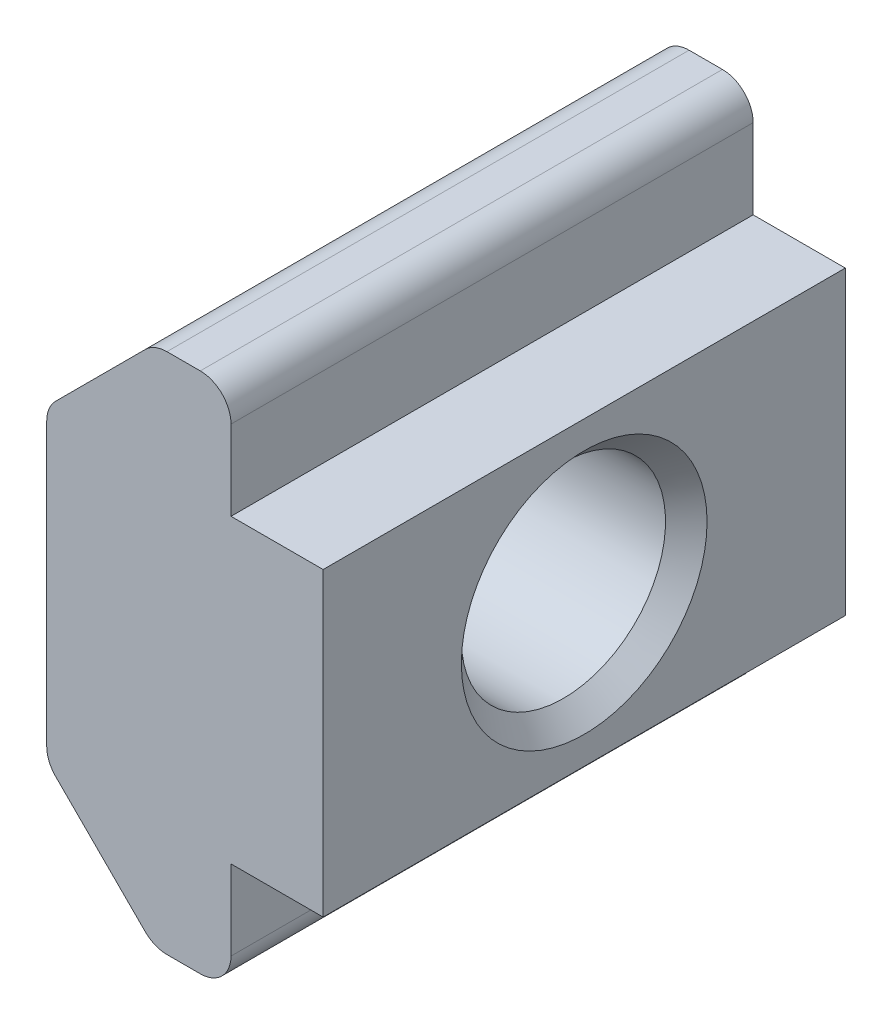
ISO-10303-21;
HEADER;
FILE_DESCRIPTION(('STEP AP214'),'2;1');
FILE_NAME('part.step','',(''),(''),'','','');
FILE_SCHEMA(('AUTOMOTIVE_DESIGN { 1 0 10303 214 1 1 1 1 }'));
ENDSEC;
DATA;
#1=APPLICATION_CONTEXT('core data for automotive mechanical design processes');
#2=APPLICATION_PROTOCOL_DEFINITION('international standard','automotive_design',2000,#1);
#3=PRODUCT_CONTEXT('',#1,'mechanical');
#4=PRODUCT('Part','Part','',(#3));
#5=PRODUCT_RELATED_PRODUCT_CATEGORY('part','',(#4));
#6=PRODUCT_DEFINITION_FORMATION('','',#4);
#7=PRODUCT_DEFINITION_CONTEXT('part definition',#1,'design');
#8=PRODUCT_DEFINITION('design','',#6,#7);
#9=PRODUCT_DEFINITION_SHAPE('','',#8);
#10=(LENGTH_UNIT() NAMED_UNIT(*) SI_UNIT(.MILLI.,.METRE.));
#11=(NAMED_UNIT(*) PLANE_ANGLE_UNIT() SI_UNIT($,.RADIAN.));
#12=(NAMED_UNIT(*) SI_UNIT($,.STERADIAN.) SOLID_ANGLE_UNIT());
#13=UNCERTAINTY_MEASURE_WITH_UNIT(LENGTH_MEASURE(1.E-05),#10,'distance_accuracy_value','');
#14=(GEOMETRIC_REPRESENTATION_CONTEXT(3) GLOBAL_UNCERTAINTY_ASSIGNED_CONTEXT((#13)) GLOBAL_UNIT_ASSIGNED_CONTEXT((#10,
#11,#12)) REPRESENTATION_CONTEXT('',''));
#15=CARTESIAN_POINT('',(0.,0.,0.));
#16=DIRECTION('',(0.,0.,1.));
#17=DIRECTION('',(1.,0.,0.));
#18=AXIS2_PLACEMENT_3D('',#15,#16,#17);
#19=CARTESIAN_POINT('',(-9.,-4.58578643762693,8.5));
#20=DIRECTION('',(-1.,0.,0.));
#21=DIRECTION('',(0.,1.,0.));
#22=AXIS2_PLACEMENT_3D('',#19,#20,#21);
#23=PLANE('',#22);
#24=DIRECTION('',(0.,-1.,0.));
#25=VECTOR('',#24,1.);
#26=CARTESIAN_POINT('',(-9.,4.58578643762693,-8.5));
#27=LINE('',#26,#25);
#28=CARTESIAN_POINT('',(-9.,4.58578643762693,-8.5));
#29=VERTEX_POINT('',#28);
#30=CARTESIAN_POINT('',(-9.,-4.5857864376269,-8.5));
#31=VERTEX_POINT('',#30);
#32=EDGE_CURVE('E131',#29,#31,#27,.T.);
#33=ORIENTED_EDGE('',*,*,#32,.T.);
#34=DIRECTION('',(0.,0.,1.));
#35=VECTOR('',#34,1.);
#36=CARTESIAN_POINT('',(-9.,-4.5857864376269,-8.5));
#37=LINE('',#36,#35);
#38=CARTESIAN_POINT('',(-9.,-4.58578643762693,8.5));
#39=VERTEX_POINT('',#38);
#40=EDGE_CURVE('E146',#39,#31,#37,.F.);
#41=ORIENTED_EDGE('',*,*,#40,.F.);
#42=DIRECTION('',(0.,1.,0.));
#43=VECTOR('',#42,1.);
#44=CARTESIAN_POINT('',(-9.,-4.58578643762693,8.5));
#45=LINE('',#44,#43);
#46=CARTESIAN_POINT('',(-9.,4.5857864376269,8.5));
#47=VERTEX_POINT('',#46);
#48=EDGE_CURVE('E153',#47,#39,#45,.F.);
#49=ORIENTED_EDGE('',*,*,#48,.F.);
#50=DIRECTION('',(0.,0.,-1.));
#51=VECTOR('',#50,1.);
#52=CARTESIAN_POINT('',(-9.,4.5857864376269,8.5));
#53=LINE('',#52,#51);
#54=EDGE_CURVE('E148',#47,#29,#53,.T.);
#55=ORIENTED_EDGE('',*,*,#54,.T.);
#56=EDGE_LOOP('',(#33,#41,#49,#55));
#57=FACE_BOUND('',#56,.T.);
#58=CARTESIAN_POINT('',(-9.,0.,0.));
#59=DIRECTION('',(1.,0.,0.));
#60=DIRECTION('',(0.,-1.42053888207986E-07,0.99999999999999));
#61=AXIS2_PLACEMENT_3D('',#58,#59,#60);
#62=CIRCLE('',#61,4.);
#63=CARTESIAN_POINT('',(-9.,-5.68215552831942E-07,3.99999999999996));
#64=VERTEX_POINT('',#63);
#65=EDGE_CURVE('E139',#64,#64,#62,.T.);
#66=ORIENTED_EDGE('',*,*,#65,.T.);
#67=EDGE_LOOP('',(#66));
#68=FACE_BOUND('',#67,.T.);
#69=ADVANCED_FACE('F17',(#57,#68),#23,.T.);
#70=CARTESIAN_POINT('',(-8.00000000000016,-4.58578643762697,8.5));
#71=DIRECTION('',(0.,0.,-1.));
#72=DIRECTION('',(-0.707106781186453,-0.707106781186642,0.));
#73=AXIS2_PLACEMENT_3D('',#70,#71,#72);
#74=CYLINDRICAL_SURFACE('',#73,0.99999999999984);
#75=CARTESIAN_POINT('',(-8.00000000000016,-4.58578643762697,-8.5));
#76=DIRECTION('',(0.,0.,1.));
#77=DIRECTION('',(-1.,0.,0.));
#78=AXIS2_PLACEMENT_3D('',#75,#76,#77);
#79=CIRCLE('',#78,0.99999999999984);
#80=CARTESIAN_POINT('',(-8.7071067811865,-5.2928932188135,-8.5));
#81=VERTEX_POINT('',#80);
#82=EDGE_CURVE('E128',#31,#81,#79,.T.);
#83=ORIENTED_EDGE('',*,*,#82,.T.);
#84=DIRECTION('',(0.,0.,1.));
#85=VECTOR('',#84,1.);
#86=CARTESIAN_POINT('',(-8.7071067811865,-5.2928932188135,-8.5));
#87=LINE('',#86,#85);
#88=CARTESIAN_POINT('',(-8.7071067811865,-5.2928932188135,8.5));
#89=VERTEX_POINT('',#88);
#90=EDGE_CURVE('E138',#89,#81,#87,.F.);
#91=ORIENTED_EDGE('',*,*,#90,.F.);
#92=CARTESIAN_POINT('',(-8.00000000000016,-4.58578643762697,8.5));
#93=DIRECTION('',(0.,0.,-1.));
#94=DIRECTION('',(-0.707106781186453,-0.707106781186642,0.));
#95=AXIS2_PLACEMENT_3D('',#92,#93,#94);
#96=CIRCLE('',#95,0.99999999999984);
#97=EDGE_CURVE('E152',#39,#89,#96,.F.);
#98=ORIENTED_EDGE('',*,*,#97,.F.);
#99=ORIENTED_EDGE('',*,*,#40,.T.);
#100=EDGE_LOOP('',(#83,#91,#98,#99));
#101=FACE_BOUND('',#100,.T.);
#102=ADVANCED_FACE('F151',(#101),#74,.T.);
#103=CARTESIAN_POINT('',(-5.7928932188135,-8.2071067811865,-8.5));
#104=DIRECTION('',(-0.707106781186548,-0.707106781186548,0.));
#105=DIRECTION('',(0.,0.,1.));
#106=AXIS2_PLACEMENT_3D('',#103,#104,#105);
#107=PLANE('',#106);
#108=DIRECTION('',(0.707106781186547,-0.707106781186548,0.));
#109=VECTOR('',#108,1.);
#110=CARTESIAN_POINT('',(-8.7071067811865,-5.2928932188135,-8.5));
#111=LINE('',#110,#109);
#112=CARTESIAN_POINT('',(-5.7928932188135,-8.2071067811865,-8.5));
#113=VERTEX_POINT('',#112);
#114=EDGE_CURVE('E133',#81,#113,#111,.T.);
#115=ORIENTED_EDGE('',*,*,#114,.T.);
#116=DIRECTION('',(0.,0.,1.));
#117=VECTOR('',#116,1.);
#118=CARTESIAN_POINT('',(-5.7928932188135,-8.2071067811865,-8.5));
#119=LINE('',#118,#117);
#120=CARTESIAN_POINT('',(-5.7928932188135,-8.2071067811865,8.5));
#121=VERTEX_POINT('',#120);
#122=EDGE_CURVE('E177',#121,#113,#119,.F.);
#123=ORIENTED_EDGE('',*,*,#122,.F.);
#124=DIRECTION('',(-0.707106781186548,0.707106781186548,0.));
#125=VECTOR('',#124,1.);
#126=CARTESIAN_POINT('',(-5.7928932188135,-8.2071067811865,8.5));
#127=LINE('',#126,#125);
#128=EDGE_CURVE('E182',#89,#121,#127,.F.);
#129=ORIENTED_EDGE('',*,*,#128,.F.);
#130=ORIENTED_EDGE('',*,*,#90,.T.);
#131=EDGE_LOOP('',(#115,#123,#129,#130));
#132=FACE_BOUND('',#131,.T.);
#133=ADVANCED_FACE('F384',(#132),#107,.T.);
#134=CARTESIAN_POINT('',(-5.08578643762698,-7.50000000000019,8.5));
#135=DIRECTION('',(0.,0.,-1.));
#136=DIRECTION('',(0.,-1.,0.));
#137=AXIS2_PLACEMENT_3D('',#134,#135,#136);
#138=CYLINDRICAL_SURFACE('',#137,0.999999999999812);
#139=CARTESIAN_POINT('',(-5.08578643762698,-7.50000000000019,-8.5));
#140=DIRECTION('',(0.,0.,1.));
#141=DIRECTION('',(-0.707106781186652,-0.707106781186443,0.));
#142=AXIS2_PLACEMENT_3D('',#139,#140,#141);
#143=CIRCLE('',#142,0.999999999999812);
#144=CARTESIAN_POINT('',(-5.0857864376269,-8.5,-8.5));
#145=VERTEX_POINT('',#144);
#146=EDGE_CURVE('E186',#113,#145,#143,.T.);
#147=ORIENTED_EDGE('',*,*,#146,.T.);
#148=DIRECTION('',(0.,0.,1.));
#149=VECTOR('',#148,1.);
#150=CARTESIAN_POINT('',(-5.0857864376269,-8.5,-8.5));
#151=LINE('',#150,#149);
#152=CARTESIAN_POINT('',(-5.0857864376269,-8.5,8.5));
#153=VERTEX_POINT('',#152);
#154=EDGE_CURVE('E191',#153,#145,#151,.F.);
#155=ORIENTED_EDGE('',*,*,#154,.F.);
#156=CARTESIAN_POINT('',(-5.08578643762698,-7.50000000000019,8.5));
#157=DIRECTION('',(0.,0.,-1.));
#158=DIRECTION('',(0.,-1.,0.));
#159=AXIS2_PLACEMENT_3D('',#156,#157,#158);
#160=CIRCLE('',#159,0.999999999999812);
#161=EDGE_CURVE('E196',#121,#153,#160,.F.);
#162=ORIENTED_EDGE('',*,*,#161,.F.);
#163=ORIENTED_EDGE('',*,*,#122,.T.);
#164=EDGE_LOOP('',(#147,#155,#162,#163));
#165=FACE_BOUND('',#164,.T.);
#166=ADVANCED_FACE('F389',(#165),#138,.T.);
#167=CARTESIAN_POINT('',(-5.0857864376269,-8.5,-8.5));
#168=DIRECTION('',(0.,-1.,0.));
#169=DIRECTION('',(1.,0.,0.));
#170=AXIS2_PLACEMENT_3D('',#167,#168,#169);
#171=PLANE('',#170);
#172=DIRECTION('',(1.,0.,0.));
#173=VECTOR('',#172,1.);
#174=CARTESIAN_POINT('',(-5.0857864376269,-8.5,-8.5));
#175=LINE('',#174,#173);
#176=CARTESIAN_POINT('',(-4.,-8.5,-8.5));
#177=VERTEX_POINT('',#176);
#178=EDGE_CURVE('E200',#145,#177,#175,.T.);
#179=ORIENTED_EDGE('',*,*,#178,.T.);
#180=DIRECTION('',(0.,0.,1.));
#181=VECTOR('',#180,1.);
#182=CARTESIAN_POINT('',(-4.,-8.5,-8.5));
#183=LINE('',#182,#181);
#184=CARTESIAN_POINT('',(-4.,-8.5,8.5));
#185=VERTEX_POINT('',#184);
#186=EDGE_CURVE('E205',#185,#177,#183,.F.);
#187=ORIENTED_EDGE('',*,*,#186,.F.);
#188=DIRECTION('',(-1.,0.,0.));
#189=VECTOR('',#188,1.);
#190=CARTESIAN_POINT('',(-4.,-8.5,8.5));
#191=LINE('',#190,#189);
#192=EDGE_CURVE('E210',#153,#185,#191,.F.);
#193=ORIENTED_EDGE('',*,*,#192,.F.);
#194=ORIENTED_EDGE('',*,*,#154,.T.);
#195=EDGE_LOOP('',(#179,#187,#193,#194));
#196=FACE_BOUND('',#195,.T.);
#197=ADVANCED_FACE('F393',(#196),#171,.T.);
#198=CARTESIAN_POINT('',(-4.00000000000017,-7.49999999999984,8.5));
#199=DIRECTION('',(0.,0.,-1.));
#200=DIRECTION('',(1.,0.,0.));
#201=AXIS2_PLACEMENT_3D('',#198,#199,#200);
#202=CYLINDRICAL_SURFACE('',#201,1.00000000000016);
#203=CARTESIAN_POINT('',(-4.00000000000017,-7.49999999999984,-8.5));
#204=DIRECTION('',(0.,0.,1.));
#205=DIRECTION('',(1.65201186064197E-13,-1.,0.));
#206=AXIS2_PLACEMENT_3D('',#203,#204,#205);
#207=CIRCLE('',#206,1.00000000000016);
#208=CARTESIAN_POINT('',(-3.,-7.49999999999992,-8.5));
#209=VERTEX_POINT('',#208);
#210=EDGE_CURVE('E214',#177,#209,#207,.T.);
#211=ORIENTED_EDGE('',*,*,#210,.T.);
#212=DIRECTION('',(0.,0.,1.));
#213=VECTOR('',#212,1.);
#214=CARTESIAN_POINT('',(-3.,-7.49999999999992,-8.5));
#215=LINE('',#214,#213);
#216=CARTESIAN_POINT('',(-3.,-7.49999999999996,8.5));
#217=VERTEX_POINT('',#216);
#218=EDGE_CURVE('E219',#217,#209,#215,.F.);
#219=ORIENTED_EDGE('',*,*,#218,.F.);
#220=CARTESIAN_POINT('',(-4.00000000000017,-7.49999999999984,8.5));
#221=DIRECTION('',(0.,0.,-1.));
#222=DIRECTION('',(1.,-1.19904086659497E-13,0.));
#223=AXIS2_PLACEMENT_3D('',#220,#221,#222);
#224=CIRCLE('',#223,1.00000000000016);
#225=EDGE_CURVE('E224',#185,#217,#224,.F.);
#226=ORIENTED_EDGE('',*,*,#225,.F.);
#227=ORIENTED_EDGE('',*,*,#186,.T.);
#228=EDGE_LOOP('',(#211,#219,#226,#227));
#229=FACE_BOUND('',#228,.T.);
#230=ADVANCED_FACE('F397',(#229),#202,.T.);
#231=CARTESIAN_POINT('',(-3.,-7.5,-8.5));
#232=DIRECTION('',(1.,0.,0.));
#233=DIRECTION('',(0.,1.,0.));
#234=AXIS2_PLACEMENT_3D('',#231,#232,#233);
#235=PLANE('',#234);
#236=DIRECTION('',(0.,1.,0.));
#237=VECTOR('',#236,1.);
#238=CARTESIAN_POINT('',(-3.,-7.49999999999992,-8.5));
#239=LINE('',#238,#237);
#240=CARTESIAN_POINT('',(-3.,-4.9,-8.5));
#241=VERTEX_POINT('',#240);
#242=EDGE_CURVE('E228',#209,#241,#239,.T.);
#243=ORIENTED_EDGE('',*,*,#242,.T.);
#244=DIRECTION('',(0.,0.,1.));
#245=VECTOR('',#244,1.);
#246=CARTESIAN_POINT('',(-3.,-4.9,-8.5));
#247=LINE('',#246,#245);
#248=CARTESIAN_POINT('',(-3.,-4.9,8.5));
#249=VERTEX_POINT('',#248);
#250=EDGE_CURVE('E233',#249,#241,#247,.F.);
#251=ORIENTED_EDGE('',*,*,#250,.F.);
#252=DIRECTION('',(0.,-1.,0.));
#253=VECTOR('',#252,1.);
#254=CARTESIAN_POINT('',(-3.,-4.9,8.5));
#255=LINE('',#254,#253);
#256=EDGE_CURVE('E238',#217,#249,#255,.F.);
#257=ORIENTED_EDGE('',*,*,#256,.F.);
#258=ORIENTED_EDGE('',*,*,#218,.T.);
#259=EDGE_LOOP('',(#243,#251,#257,#258));
#260=FACE_BOUND('',#259,.T.);
#261=ADVANCED_FACE('F401',(#260),#235,.T.);
#262=CARTESIAN_POINT('',(-3.,-4.9,-8.5));
#263=DIRECTION('',(0.,-1.,0.));
#264=DIRECTION('',(1.,0.,0.));
#265=AXIS2_PLACEMENT_3D('',#262,#263,#264);
#266=PLANE('',#265);
#267=DIRECTION('',(1.,0.,0.));
#268=VECTOR('',#267,1.);
#269=CARTESIAN_POINT('',(-3.,-4.9,-8.5));
#270=LINE('',#269,#268);
#271=CARTESIAN_POINT('',(0.,-4.9,-8.5));
#272=VERTEX_POINT('',#271);
#273=EDGE_CURVE('E242',#241,#272,#270,.T.);
#274=ORIENTED_EDGE('',*,*,#273,.T.);
#275=DIRECTION('',(0.,0.,1.));
#276=VECTOR('',#275,1.);
#277=CARTESIAN_POINT('',(0.,-4.9,-8.5));
#278=LINE('',#277,#276);
#279=CARTESIAN_POINT('',(0.,-4.9,8.5));
#280=VERTEX_POINT('',#279);
#281=EDGE_CURVE('E247',#280,#272,#278,.F.);
#282=ORIENTED_EDGE('',*,*,#281,.F.);
#283=DIRECTION('',(-1.,0.,0.));
#284=VECTOR('',#283,1.);
#285=CARTESIAN_POINT('',(0.,-4.9,8.5));
#286=LINE('',#285,#284);
#287=EDGE_CURVE('E252',#249,#280,#286,.F.);
#288=ORIENTED_EDGE('',*,*,#287,.F.);
#289=ORIENTED_EDGE('',*,*,#250,.T.);
#290=EDGE_LOOP('',(#274,#282,#288,#289));
#291=FACE_BOUND('',#290,.T.);
#292=ADVANCED_FACE('F405',(#291),#266,.T.);
#293=CARTESIAN_POINT('',(0.,-4.9,-8.5));
#294=DIRECTION('',(1.,0.,0.));
#295=DIRECTION('',(0.,1.,0.));
#296=AXIS2_PLACEMENT_3D('',#293,#294,#295);
#297=PLANE('',#296);
#298=DIRECTION('',(0.,1.,0.));
#299=VECTOR('',#298,1.);
#300=CARTESIAN_POINT('',(0.,-4.9,-8.5));
#301=LINE('',#300,#299);
#302=CARTESIAN_POINT('',(0.,4.9,-8.5));
#303=VERTEX_POINT('',#302);
#304=EDGE_CURVE('E256',#272,#303,#301,.T.);
#305=ORIENTED_EDGE('',*,*,#304,.T.);
#306=DIRECTION('',(0.,0.,1.));
#307=VECTOR('',#306,1.);
#308=CARTESIAN_POINT('',(0.,4.9,-8.5));
#309=LINE('',#308,#307);
#310=CARTESIAN_POINT('',(0.,4.9,8.5));
#311=VERTEX_POINT('',#310);
#312=EDGE_CURVE('E261',#311,#303,#309,.F.);
#313=ORIENTED_EDGE('',*,*,#312,.F.);
#314=DIRECTION('',(0.,-1.,0.));
#315=VECTOR('',#314,1.);
#316=CARTESIAN_POINT('',(0.,4.9,8.5));
#317=LINE('',#316,#315);
#318=EDGE_CURVE('E266',#280,#311,#317,.F.);
#319=ORIENTED_EDGE('',*,*,#318,.F.);
#320=ORIENTED_EDGE('',*,*,#281,.T.);
#321=EDGE_LOOP('',(#305,#313,#319,#320));
#322=FACE_BOUND('',#321,.T.);
#323=CARTESIAN_POINT('',(0.,0.,0.));
#324=DIRECTION('',(-1.,0.,0.));
#325=DIRECTION('',(0.,0.,-1.));
#326=AXIS2_PLACEMENT_3D('',#323,#324,#325);
#327=CIRCLE('',#326,4.);
#328=CARTESIAN_POINT('',(0.,0.,-4.));
#329=VERTEX_POINT('',#328);
#330=EDGE_CURVE('E270',#329,#329,#327,.F.);
#331=ORIENTED_EDGE('',*,*,#330,.F.);
#332=EDGE_LOOP('',(#331));
#333=FACE_BOUND('',#332,.T.);
#334=ADVANCED_FACE('F409',(#322,#333),#297,.T.);
#335=CARTESIAN_POINT('',(-3.,4.9,8.5));
#336=DIRECTION('',(0.,1.,0.));
#337=DIRECTION('',(1.,0.,0.));
#338=AXIS2_PLACEMENT_3D('',#335,#336,#337);
#339=PLANE('',#338);
#340=DIRECTION('',(-1.,0.,0.));
#341=VECTOR('',#340,1.);
#342=CARTESIAN_POINT('',(0.,4.9,-8.5));
#343=LINE('',#342,#341);
#344=CARTESIAN_POINT('',(-3.,4.9,-8.5));
#345=VERTEX_POINT('',#344);
#346=EDGE_CURVE('E275',#303,#345,#343,.T.);
#347=ORIENTED_EDGE('',*,*,#346,.T.);
#348=DIRECTION('',(0.,0.,1.));
#349=VECTOR('',#348,1.);
#350=CARTESIAN_POINT('',(-3.,4.9,-8.5));
#351=LINE('',#350,#349);
#352=CARTESIAN_POINT('',(-3.,4.9,8.5));
#353=VERTEX_POINT('',#352);
#354=EDGE_CURVE('E278',#353,#345,#351,.F.);
#355=ORIENTED_EDGE('',*,*,#354,.F.);
#356=DIRECTION('',(1.,0.,0.));
#357=VECTOR('',#356,1.);
#358=CARTESIAN_POINT('',(-3.,4.9,8.5));
#359=LINE('',#358,#357);
#360=EDGE_CURVE('E283',#311,#353,#359,.F.);
#361=ORIENTED_EDGE('',*,*,#360,.F.);
#362=ORIENTED_EDGE('',*,*,#312,.T.);
#363=EDGE_LOOP('',(#347,#355,#361,#362));
#364=FACE_BOUND('',#363,.T.);
#365=ADVANCED_FACE('F413',(#364),#339,.T.);
#366=CARTESIAN_POINT('',(-3.,4.9,-8.5));
#367=DIRECTION('',(1.,0.,0.));
#368=DIRECTION('',(0.,1.,0.));
#369=AXIS2_PLACEMENT_3D('',#366,#367,#368);
#370=PLANE('',#369);
#371=DIRECTION('',(0.,1.,0.));
#372=VECTOR('',#371,1.);
#373=CARTESIAN_POINT('',(-3.,4.9,-8.5));
#374=LINE('',#373,#372);
#375=CARTESIAN_POINT('',(-3.,7.49999999999996,-8.5));
#376=VERTEX_POINT('',#375);
#377=EDGE_CURVE('E287',#345,#376,#374,.T.);
#378=ORIENTED_EDGE('',*,*,#377,.T.);
#379=DIRECTION('',(0.,0.,1.));
#380=VECTOR('',#379,1.);
#381=CARTESIAN_POINT('',(-3.,7.49999999999996,-8.5));
#382=LINE('',#381,#380);
#383=CARTESIAN_POINT('',(-3.,7.49999999999996,8.5));
#384=VERTEX_POINT('',#383);
#385=EDGE_CURVE('E292',#384,#376,#382,.F.);
#386=ORIENTED_EDGE('',*,*,#385,.F.);
#387=DIRECTION('',(0.,-1.,0.));
#388=VECTOR('',#387,1.);
#389=CARTESIAN_POINT('',(-3.,7.49999999999996,8.5));
#390=LINE('',#389,#388);
#391=EDGE_CURVE('E297',#353,#384,#390,.F.);
#392=ORIENTED_EDGE('',*,*,#391,.F.);
#393=ORIENTED_EDGE('',*,*,#354,.T.);
#394=EDGE_LOOP('',(#378,#386,#392,#393));
#395=FACE_BOUND('',#394,.T.);
#396=ADVANCED_FACE('F417',(#395),#370,.T.);
#397=CARTESIAN_POINT('',(-4.00000000000017,7.49999999999984,8.5));
#398=DIRECTION('',(0.,0.,-1.));
#399=DIRECTION('',(1.65139953724266E-13,1.,0.));
#400=AXIS2_PLACEMENT_3D('',#397,#398,#399);
#401=CYLINDRICAL_SURFACE('',#400,1.00000000000016);
#402=CARTESIAN_POINT('',(-4.00000000000017,7.49999999999984,-8.5));
#403=DIRECTION('',(0.,0.,1.));
#404=DIRECTION('',(1.,1.21680443498897E-13,0.));
#405=AXIS2_PLACEMENT_3D('',#402,#403,#404);
#406=CIRCLE('',#405,1.00000000000016);
#407=CARTESIAN_POINT('',(-4.,8.5,-8.5));
#408=VERTEX_POINT('',#407);
#409=EDGE_CURVE('E301',#376,#408,#406,.T.);
#410=ORIENTED_EDGE('',*,*,#409,.T.);
#411=DIRECTION('',(0.,0.,1.));
#412=VECTOR('',#411,1.);
#413=CARTESIAN_POINT('',(-4.,8.5,-8.5));
#414=LINE('',#413,#412);
#415=CARTESIAN_POINT('',(-4.,8.5,8.5));
#416=VERTEX_POINT('',#415);
#417=EDGE_CURVE('E306',#416,#408,#414,.F.);
#418=ORIENTED_EDGE('',*,*,#417,.F.);
#419=CARTESIAN_POINT('',(-4.00000000000017,7.49999999999984,8.5));
#420=DIRECTION('',(0.,0.,-1.));
#421=DIRECTION('',(1.65201186064196E-13,1.,0.));
#422=AXIS2_PLACEMENT_3D('',#419,#420,#421);
#423=CIRCLE('',#422,1.00000000000016);
#424=EDGE_CURVE('E311',#384,#416,#423,.F.);
#425=ORIENTED_EDGE('',*,*,#424,.F.);
#426=ORIENTED_EDGE('',*,*,#385,.T.);
#427=EDGE_LOOP('',(#410,#418,#425,#426));
#428=FACE_BOUND('',#427,.T.);
#429=ADVANCED_FACE('F421',(#428),#401,.T.);
#430=CARTESIAN_POINT('',(-5.0857864376269,8.5,8.5));
#431=DIRECTION('',(0.,1.,0.));
#432=DIRECTION('',(1.,0.,0.));
#433=AXIS2_PLACEMENT_3D('',#430,#431,#432);
#434=PLANE('',#433);
#435=DIRECTION('',(-1.,0.,0.));
#436=VECTOR('',#435,1.);
#437=CARTESIAN_POINT('',(-4.,8.5,-8.5));
#438=LINE('',#437,#436);
#439=CARTESIAN_POINT('',(-5.0857864376269,8.5,-8.5));
#440=VERTEX_POINT('',#439);
#441=EDGE_CURVE('E315',#408,#440,#438,.T.);
#442=ORIENTED_EDGE('',*,*,#441,.T.);
#443=DIRECTION('',(0.,0.,1.));
#444=VECTOR('',#443,1.);
#445=CARTESIAN_POINT('',(-5.0857864376269,8.5,-8.5));
#446=LINE('',#445,#444);
#447=CARTESIAN_POINT('',(-5.0857864376269,8.5,8.5));
#448=VERTEX_POINT('',#447);
#449=EDGE_CURVE('E320',#448,#440,#446,.F.);
#450=ORIENTED_EDGE('',*,*,#449,.F.);
#451=DIRECTION('',(1.,0.,0.));
#452=VECTOR('',#451,1.);
#453=CARTESIAN_POINT('',(-5.0857864376269,8.5,8.5));
#454=LINE('',#453,#452);
#455=EDGE_CURVE('E325',#416,#448,#454,.F.);
#456=ORIENTED_EDGE('',*,*,#455,.F.);
#457=ORIENTED_EDGE('',*,*,#417,.T.);
#458=EDGE_LOOP('',(#442,#450,#456,#457));
#459=FACE_BOUND('',#458,.T.);
#460=ADVANCED_FACE('F425',(#459),#434,.T.);
#461=CARTESIAN_POINT('',(-5.08578643762698,7.50000000000019,8.5));
#462=DIRECTION('',(0.,0.,-1.));
#463=DIRECTION('',(-0.707106781186653,0.707106781186442,0.));
#464=AXIS2_PLACEMENT_3D('',#461,#462,#463);
#465=CYLINDRICAL_SURFACE('',#464,0.999999999999812);
#466=CARTESIAN_POINT('',(-5.08578643762698,7.50000000000019,-8.5));
#467=DIRECTION('',(0.,0.,1.));
#468=DIRECTION('',(0.,1.,0.));
#469=AXIS2_PLACEMENT_3D('',#466,#467,#468);
#470=CIRCLE('',#469,0.999999999999812);
#471=CARTESIAN_POINT('',(-5.7928932188135,8.2071067811865,-8.5));
#472=VERTEX_POINT('',#471);
#473=EDGE_CURVE('E329',#440,#472,#470,.T.);
#474=ORIENTED_EDGE('',*,*,#473,.T.);
#475=DIRECTION('',(0.,0.,1.));
#476=VECTOR('',#475,1.);
#477=CARTESIAN_POINT('',(-5.7928932188135,8.2071067811865,-8.5));
#478=LINE('',#477,#476);
#479=CARTESIAN_POINT('',(-5.7928932188135,8.2071067811865,8.5));
#480=VERTEX_POINT('',#479);
#481=EDGE_CURVE('E334',#480,#472,#478,.F.);
#482=ORIENTED_EDGE('',*,*,#481,.F.);
#483=CARTESIAN_POINT('',(-5.08578643762698,7.50000000000019,8.5));
#484=DIRECTION('',(0.,0.,-1.));
#485=DIRECTION('',(-0.707106781186653,0.707106781186442,0.));
#486=AXIS2_PLACEMENT_3D('',#483,#484,#485);
#487=CIRCLE('',#486,0.999999999999812);
#488=EDGE_CURVE('E339',#448,#480,#487,.F.);
#489=ORIENTED_EDGE('',*,*,#488,.F.);
#490=ORIENTED_EDGE('',*,*,#449,.T.);
#491=EDGE_LOOP('',(#474,#482,#489,#490));
#492=FACE_BOUND('',#491,.T.);
#493=ADVANCED_FACE('F429',(#492),#465,.T.);
#494=CARTESIAN_POINT('',(-8.7071067811865,5.2928932188135,-8.5));
#495=DIRECTION('',(-0.707106781186548,0.707106781186548,0.));
#496=DIRECTION('',(0.,0.,1.));
#497=AXIS2_PLACEMENT_3D('',#494,#495,#496);
#498=PLANE('',#497);
#499=DIRECTION('',(-0.707106781186548,-0.707106781186547,0.));
#500=VECTOR('',#499,1.);
#501=CARTESIAN_POINT('',(-5.7928932188135,8.2071067811865,-8.5));
#502=LINE('',#501,#500);
#503=CARTESIAN_POINT('',(-8.7071067811865,5.2928932188135,-8.5));
#504=VERTEX_POINT('',#503);
#505=EDGE_CURVE('E343',#472,#504,#502,.T.);
#506=ORIENTED_EDGE('',*,*,#505,.T.);
#507=DIRECTION('',(0.,0.,1.));
#508=VECTOR('',#507,1.);
#509=CARTESIAN_POINT('',(-8.7071067811865,5.2928932188135,-8.5));
#510=LINE('',#509,#508);
#511=CARTESIAN_POINT('',(-8.7071067811865,5.2928932188135,8.5));
#512=VERTEX_POINT('',#511);
#513=EDGE_CURVE('E347',#512,#504,#510,.F.);
#514=ORIENTED_EDGE('',*,*,#513,.F.);
#515=DIRECTION('',(0.707106781186548,0.707106781186548,0.));
#516=VECTOR('',#515,1.);
#517=CARTESIAN_POINT('',(-8.7071067811865,5.2928932188135,8.5));
#518=LINE('',#517,#516);
#519=EDGE_CURVE('E32',#480,#512,#518,.F.);
#520=ORIENTED_EDGE('',*,*,#519,.F.);
#521=ORIENTED_EDGE('',*,*,#481,.T.);
#522=EDGE_LOOP('',(#506,#514,#520,#521));
#523=FACE_BOUND('',#522,.T.);
#524=ADVANCED_FACE('F433',(#523),#498,.T.);
#525=CARTESIAN_POINT('',(-8.00000000000016,4.58578643762697,8.5));
#526=DIRECTION('',(0.,0.,-1.));
#527=DIRECTION('',(-1.,0.,0.));
#528=AXIS2_PLACEMENT_3D('',#525,#526,#527);
#529=CYLINDRICAL_SURFACE('',#528,0.999999999999839);
#530=CARTESIAN_POINT('',(-8.00000000000016,4.58578643762697,-8.5));
#531=DIRECTION('',(0.,0.,1.));
#532=DIRECTION('',(-0.707106781186453,0.707106781186643,0.));
#533=AXIS2_PLACEMENT_3D('',#530,#531,#532);
#534=CIRCLE('',#533,0.999999999999839);
#535=EDGE_CURVE('E40',#504,#29,#534,.T.);
#536=ORIENTED_EDGE('',*,*,#535,.T.);
#537=ORIENTED_EDGE('',*,*,#54,.F.);
#538=CARTESIAN_POINT('',(-8.00000000000016,4.58578643762697,8.5));
#539=DIRECTION('',(0.,0.,-1.));
#540=DIRECTION('',(-1.,0.,0.));
#541=AXIS2_PLACEMENT_3D('',#538,#539,#540);
#542=CIRCLE('',#541,0.999999999999839);
#543=EDGE_CURVE('E358',#512,#47,#542,.F.);
#544=ORIENTED_EDGE('',*,*,#543,.F.);
#545=ORIENTED_EDGE('',*,*,#513,.T.);
#546=EDGE_LOOP('',(#536,#537,#544,#545));
#547=FACE_BOUND('',#546,.T.);
#548=ADVANCED_FACE('F437',(#547),#529,.T.);
#549=CARTESIAN_POINT('',(-9.00000000000002,-8.50000000000002,8.5));
#550=DIRECTION('',(0.,0.,1.));
#551=DIRECTION('',(1.,0.,0.));
#552=AXIS2_PLACEMENT_3D('',#549,#550,#551);
#553=PLANE('',#552);
#554=ORIENTED_EDGE('',*,*,#48,.T.);
#555=ORIENTED_EDGE('',*,*,#97,.T.);
#556=ORIENTED_EDGE('',*,*,#128,.T.);
#557=ORIENTED_EDGE('',*,*,#161,.T.);
#558=ORIENTED_EDGE('',*,*,#192,.T.);
#559=ORIENTED_EDGE('',*,*,#225,.T.);
#560=ORIENTED_EDGE('',*,*,#256,.T.);
#561=ORIENTED_EDGE('',*,*,#287,.T.);
#562=ORIENTED_EDGE('',*,*,#318,.T.);
#563=ORIENTED_EDGE('',*,*,#360,.T.);
#564=ORIENTED_EDGE('',*,*,#391,.T.);
#565=ORIENTED_EDGE('',*,*,#424,.T.);
#566=ORIENTED_EDGE('',*,*,#455,.T.);
#567=ORIENTED_EDGE('',*,*,#488,.T.);
#568=ORIENTED_EDGE('',*,*,#519,.T.);
#569=ORIENTED_EDGE('',*,*,#543,.T.);
#570=EDGE_LOOP('',(#554,#555,#556,#557,#558,#559,#560,#561,#562,#563,#564,#565,#566,#567,#568,#569));
#571=FACE_BOUND('',#570,.T.);
#572=ADVANCED_FACE('F441',(#571),#553,.T.);
#573=CARTESIAN_POINT('',(-9.00000000000002,-8.50000000000002,-8.5));
#574=DIRECTION('',(0.,0.,-1.));
#575=DIRECTION('',(0.,1.,0.));
#576=AXIS2_PLACEMENT_3D('',#573,#574,#575);
#577=PLANE('',#576);
#578=ORIENTED_EDGE('',*,*,#32,.F.);
#579=ORIENTED_EDGE('',*,*,#535,.F.);
#580=ORIENTED_EDGE('',*,*,#505,.F.);
#581=ORIENTED_EDGE('',*,*,#473,.F.);
#582=ORIENTED_EDGE('',*,*,#441,.F.);
#583=ORIENTED_EDGE('',*,*,#409,.F.);
#584=ORIENTED_EDGE('',*,*,#377,.F.);
#585=ORIENTED_EDGE('',*,*,#346,.F.);
#586=ORIENTED_EDGE('',*,*,#304,.F.);
#587=ORIENTED_EDGE('',*,*,#273,.F.);
#588=ORIENTED_EDGE('',*,*,#242,.F.);
#589=ORIENTED_EDGE('',*,*,#210,.F.);
#590=ORIENTED_EDGE('',*,*,#178,.F.);
#591=ORIENTED_EDGE('',*,*,#146,.F.);
#592=ORIENTED_EDGE('',*,*,#114,.F.);
#593=ORIENTED_EDGE('',*,*,#82,.F.);
#594=EDGE_LOOP('',(#578,#579,#580,#581,#582,#583,#584,#585,#586,#587,#588,#589,#590,#591,#592,#593));
#595=FACE_BOUND('',#594,.T.);
#596=ADVANCED_FACE('F130',(#595),#577,.T.);
#597=CARTESIAN_POINT('',(-9.,0.,0.));
#598=DIRECTION('',(-1.,0.,0.));
#599=DIRECTION('',(0.,0.,-1.));
#600=AXIS2_PLACEMENT_3D('',#597,#598,#599);
#601=CONICAL_SURFACE('',#600,4.,0.785398163397447);
#602=ORIENTED_EDGE('',*,*,#65,.F.);
#603=EDGE_LOOP('',(#602));
#604=FACE_BOUND('',#603,.T.);
#605=CARTESIAN_POINT('',(-8.3235,0.,0.));
#606=DIRECTION('',(1.,0.,0.));
#607=DIRECTION('',(0.,0.,1.));
#608=AXIS2_PLACEMENT_3D('',#605,#606,#607);
#609=CIRCLE('',#608,3.3235);
#610=CARTESIAN_POINT('',(-8.3235,0.,3.3235));
#611=VERTEX_POINT('',#610);
#612=EDGE_CURVE('E25',#611,#611,#609,.T.);
#613=ORIENTED_EDGE('',*,*,#612,.T.);
#614=EDGE_LOOP('',(#613));
#615=FACE_BOUND('',#614,.T.);
#616=ADVANCED_FACE('F366',(#604,#615),#601,.F.);
#617=CARTESIAN_POINT('',(0.,0.,0.));
#618=DIRECTION('',(1.,0.,0.));
#619=DIRECTION('',(0.,0.,1.));
#620=AXIS2_PLACEMENT_3D('',#617,#618,#619);
#621=CYLINDRICAL_SURFACE('',#620,3.3235);
#622=CARTESIAN_POINT('',(-0.6765,0.,0.));
#623=DIRECTION('',(1.,0.,0.));
#624=DIRECTION('',(0.,0.,1.));
#625=AXIS2_PLACEMENT_3D('',#622,#623,#624);
#626=CIRCLE('',#625,3.3235);
#627=CARTESIAN_POINT('',(-0.6765,0.,3.3235));
#628=VERTEX_POINT('',#627);
#629=EDGE_CURVE('E11',#628,#628,#626,.T.);
#630=ORIENTED_EDGE('',*,*,#629,.T.);
#631=EDGE_LOOP('',(#630));
#632=FACE_BOUND('',#631,.T.);
#633=ORIENTED_EDGE('',*,*,#612,.F.);
#634=EDGE_LOOP('',(#633));
#635=FACE_BOUND('',#634,.T.);
#636=ADVANCED_FACE('F368',(#632,#635),#621,.F.);
#637=CARTESIAN_POINT('',(0.,0.,0.));
#638=DIRECTION('',(1.,0.,0.));
#639=DIRECTION('',(0.,0.,1.));
#640=AXIS2_PLACEMENT_3D('',#637,#638,#639);
#641=CONICAL_SURFACE('',#640,4.,0.785398163397447);
#642=ORIENTED_EDGE('',*,*,#330,.T.);
#643=EDGE_LOOP('',(#642));
#644=FACE_BOUND('',#643,.T.);
#645=ORIENTED_EDGE('',*,*,#629,.F.);
#646=EDGE_LOOP('',(#645));
#647=FACE_BOUND('',#646,.T.);
#648=ADVANCED_FACE('F19',(#644,#647),#641,.F.);
#649=CLOSED_SHELL('',(#69,#102,#133,#166,#197,#230,#261,#292,#334,#365,#396,#429,#460,#493,#524,
#548,#572,#596,#616,#636,#648));
#650=MANIFOLD_SOLID_BREP('B1',#649);
#651=ADVANCED_BREP_SHAPE_REPRESENTATION('',(#18,#650),#14);
#652=SHAPE_DEFINITION_REPRESENTATION(#9,#651);
ENDSEC;
END-ISO-10303-21;
